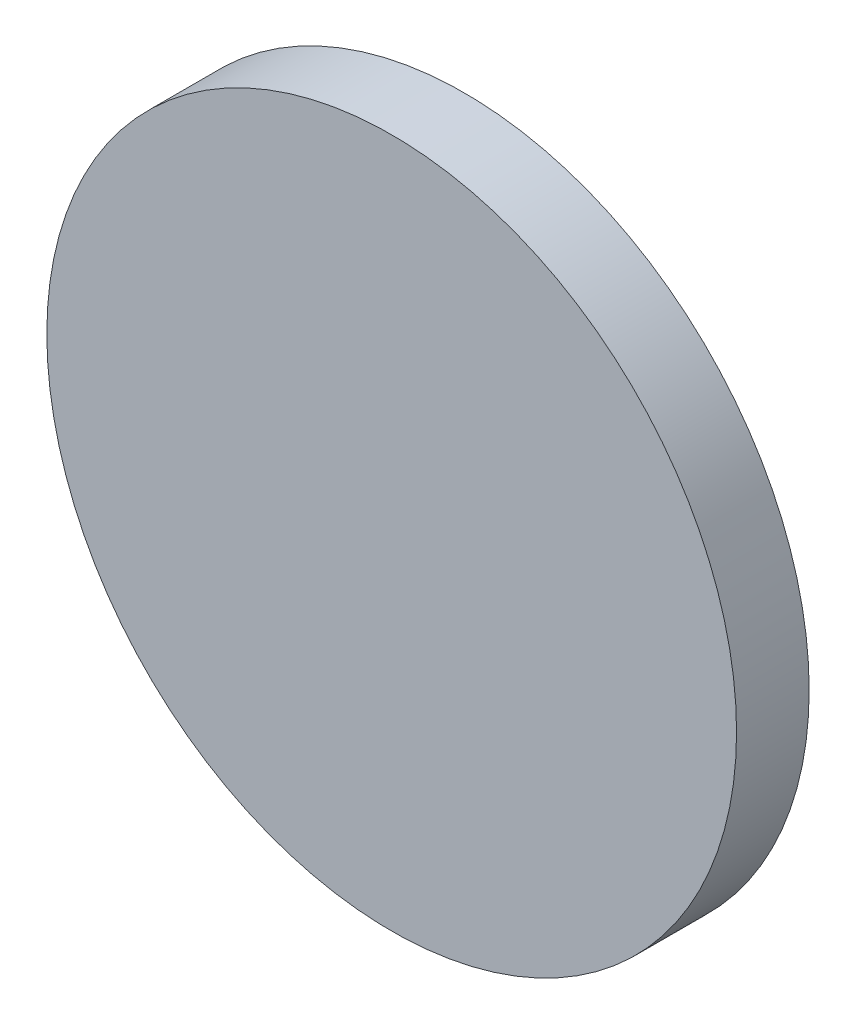
ISO-10303-21;
HEADER;
FILE_DESCRIPTION(('STEP AP214'),'2;1');
FILE_NAME('part.step','',(''),(''),'','','');
FILE_SCHEMA(('AUTOMOTIVE_DESIGN { 1 0 10303 214 1 1 1 1 }'));
ENDSEC;
DATA;
#1=APPLICATION_CONTEXT('core data for automotive mechanical design processes');
#2=APPLICATION_PROTOCOL_DEFINITION('international standard','automotive_design',2000,#1);
#3=PRODUCT_CONTEXT('',#1,'mechanical');
#4=PRODUCT('Part','Part','',(#3));
#5=PRODUCT_RELATED_PRODUCT_CATEGORY('part','',(#4));
#6=PRODUCT_DEFINITION_FORMATION('','',#4);
#7=PRODUCT_DEFINITION_CONTEXT('part definition',#1,'design');
#8=PRODUCT_DEFINITION('design','',#6,#7);
#9=PRODUCT_DEFINITION_SHAPE('','',#8);
#10=(LENGTH_UNIT() NAMED_UNIT(*) SI_UNIT(.MILLI.,.METRE.));
#11=(NAMED_UNIT(*) PLANE_ANGLE_UNIT() SI_UNIT($,.RADIAN.));
#12=(NAMED_UNIT(*) SI_UNIT($,.STERADIAN.) SOLID_ANGLE_UNIT());
#13=UNCERTAINTY_MEASURE_WITH_UNIT(LENGTH_MEASURE(1.E-05),#10,'distance_accuracy_value','');
#14=(GEOMETRIC_REPRESENTATION_CONTEXT(3) GLOBAL_UNCERTAINTY_ASSIGNED_CONTEXT((#13)) GLOBAL_UNIT_ASSIGNED_CONTEXT((#10,
#11,#12)) REPRESENTATION_CONTEXT('',''));
#15=CARTESIAN_POINT('',(0.,0.,0.));
#16=DIRECTION('',(0.,0.,1.));
#17=DIRECTION('',(1.,0.,0.));
#18=AXIS2_PLACEMENT_3D('',#15,#16,#17);
#19=CARTESIAN_POINT('',(0.,0.,3.175));
#20=DIRECTION('',(0.,0.,-1.));
#21=DIRECTION('',(-1.,0.,0.));
#22=AXIS2_PLACEMENT_3D('',#19,#20,#21);
#23=CYLINDRICAL_SURFACE('',#22,30.1625);
#24=CARTESIAN_POINT('',(0.,0.,3.175));
#25=DIRECTION('',(0.,0.,1.));
#26=DIRECTION('',(1.,0.,0.));
#27=AXIS2_PLACEMENT_3D('',#24,#25,#26);
#28=CIRCLE('',#27,30.1625);
#29=CARTESIAN_POINT('',(30.1625,0.,3.175));
#30=VERTEX_POINT('',#29);
#31=EDGE_CURVE('E10',#30,#30,#28,.T.);
#32=ORIENTED_EDGE('',*,*,#31,.F.);
#33=EDGE_LOOP('',(#32));
#34=FACE_BOUND('',#33,.T.);
#35=CARTESIAN_POINT('',(0.,0.,-3.175));
#36=DIRECTION('',(0.,0.,1.));
#37=DIRECTION('',(1.,0.,0.));
#38=AXIS2_PLACEMENT_3D('',#35,#36,#37);
#39=CIRCLE('',#38,30.1625);
#40=CARTESIAN_POINT('',(30.1625,0.,-3.175));
#41=VERTEX_POINT('',#40);
#42=EDGE_CURVE('E40',#41,#41,#39,.T.);
#43=ORIENTED_EDGE('',*,*,#42,.T.);
#44=EDGE_LOOP('',(#43));
#45=FACE_BOUND('',#44,.T.);
#46=ADVANCED_FACE('F37',(#34,#45),#23,.T.);
#47=CARTESIAN_POINT('',(0.,0.,3.175));
#48=DIRECTION('',(0.,0.,1.));
#49=DIRECTION('',(1.,0.,0.));
#50=AXIS2_PLACEMENT_3D('',#47,#48,#49);
#51=PLANE('',#50);
#52=ORIENTED_EDGE('',*,*,#31,.T.);
#53=EDGE_LOOP('',(#52));
#54=FACE_BOUND('',#53,.T.);
#55=ADVANCED_FACE('F52',(#54),#51,.T.);
#56=CARTESIAN_POINT('',(0.,0.,-3.175));
#57=DIRECTION('',(0.,0.,1.));
#58=DIRECTION('',(1.,0.,0.));
#59=AXIS2_PLACEMENT_3D('',#56,#57,#58);
#60=PLANE('',#59);
#61=ORIENTED_EDGE('',*,*,#42,.F.);
#62=EDGE_LOOP('',(#61));
#63=FACE_BOUND('',#62,.T.);
#64=ADVANCED_FACE('F50',(#63),#60,.F.);
#65=CLOSED_SHELL('',(#46,#55,#64));
#66=MANIFOLD_SOLID_BREP('B2',#65);
#67=ADVANCED_BREP_SHAPE_REPRESENTATION('',(#18,#66),#14);
#68=SHAPE_DEFINITION_REPRESENTATION(#9,#67);
ENDSEC;
END-ISO-10303-21;
